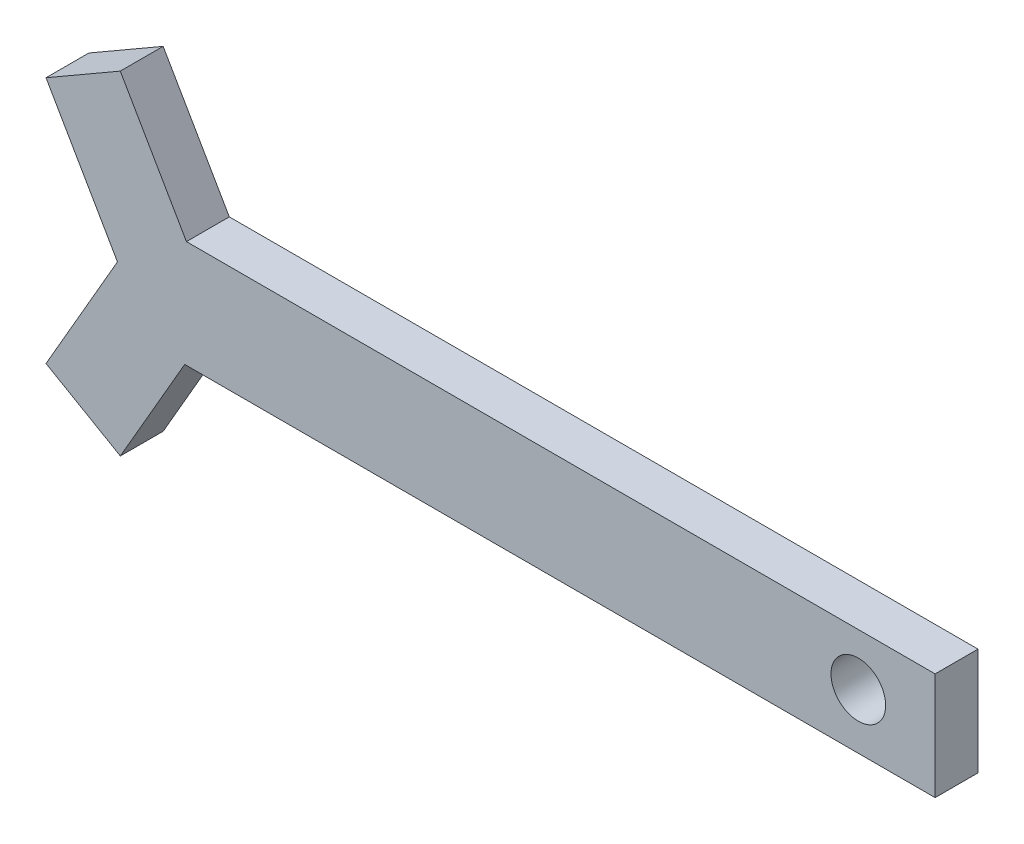
ISO-10303-21;
HEADER;
FILE_DESCRIPTION(('STEP AP214'),'2;1');
FILE_NAME('part.step','',(''),(''),'','','');
FILE_SCHEMA(('AUTOMOTIVE_DESIGN { 1 0 10303 214 1 1 1 1 }'));
ENDSEC;
DATA;
#1=APPLICATION_CONTEXT('core data for automotive mechanical design processes');
#2=APPLICATION_PROTOCOL_DEFINITION('international standard','automotive_design',2000,#1);
#3=PRODUCT_CONTEXT('',#1,'mechanical');
#4=PRODUCT('Part','Part','',(#3));
#5=PRODUCT_RELATED_PRODUCT_CATEGORY('part','',(#4));
#6=PRODUCT_DEFINITION_FORMATION('','',#4);
#7=PRODUCT_DEFINITION_CONTEXT('part definition',#1,'design');
#8=PRODUCT_DEFINITION('design','',#6,#7);
#9=PRODUCT_DEFINITION_SHAPE('','',#8);
#10=(LENGTH_UNIT() NAMED_UNIT(*) SI_UNIT(.MILLI.,.METRE.));
#11=(NAMED_UNIT(*) PLANE_ANGLE_UNIT() SI_UNIT($,.RADIAN.));
#12=(NAMED_UNIT(*) SI_UNIT($,.STERADIAN.) SOLID_ANGLE_UNIT());
#13=UNCERTAINTY_MEASURE_WITH_UNIT(LENGTH_MEASURE(1.E-05),#10,'distance_accuracy_value','');
#14=(GEOMETRIC_REPRESENTATION_CONTEXT(3) GLOBAL_UNCERTAINTY_ASSIGNED_CONTEXT((#13)) GLOBAL_UNIT_ASSIGNED_CONTEXT((#10,
#11,#12)) REPRESENTATION_CONTEXT('',''));
#15=CARTESIAN_POINT('',(0.,0.,0.));
#16=DIRECTION('',(0.,0.,1.));
#17=DIRECTION('',(1.,0.,0.));
#18=AXIS2_PLACEMENT_3D('',#15,#16,#17);
#19=CARTESIAN_POINT('',(0.,0.,4.));
#20=DIRECTION('',(0.,0.,1.));
#21=DIRECTION('',(1.,0.,0.));
#22=AXIS2_PLACEMENT_3D('',#19,#20,#21);
#23=PLANE('',#22);
#24=DIRECTION('',(0.,1.,0.));
#25=VECTOR('',#24,1.);
#26=CARTESIAN_POINT('',(52.7041909517058,-12.4004701846911,4.));
#27=LINE('',#26,#25);
#28=CARTESIAN_POINT('',(52.7041909517058,-12.4004701846911,4.));
#29=VERTEX_POINT('',#28);
#30=CARTESIAN_POINT('',(52.7041909517058,-2.40047018469109,4.));
#31=VERTEX_POINT('',#30);
#32=EDGE_CURVE('E153',#29,#31,#27,.T.);
#33=ORIENTED_EDGE('',*,*,#32,.T.);
#34=DIRECTION('',(-1.,0.,0.));
#35=VECTOR('',#34,1.);
#36=CARTESIAN_POINT('',(52.7041909517058,-2.40047018469109,4.));
#37=LINE('',#36,#35);
#38=CARTESIAN_POINT('',(-17.1361607554782,-2.40047018469109,4.));
#39=VERTEX_POINT('',#38);
#40=EDGE_CURVE('E96',#31,#39,#37,.T.);
#41=ORIENTED_EDGE('',*,*,#40,.T.);
#42=DIRECTION('',(-0.5,0.866025403784439,0.));
#43=VECTOR('',#42,1.);
#44=CARTESIAN_POINT('',(-17.1361607554782,-2.40047018469109,4.));
#45=LINE('',#44,#43);
#46=CARTESIAN_POINT('',(-23.3076426890894,8.28885008231689,4.));
#47=VERTEX_POINT('',#46);
#48=EDGE_CURVE('E171',#39,#47,#45,.T.);
#49=ORIENTED_EDGE('',*,*,#48,.T.);
#50=DIRECTION('',(-0.86602540378444,-0.499999999999997,0.));
#51=VECTOR('',#50,1.);
#52=CARTESIAN_POINT('',(-23.3076426890894,8.28885008231689,4.));
#53=LINE('',#52,#51);
#54=CARTESIAN_POINT('',(-30.2358459193649,4.28885008231693,4.));
#55=VERTEX_POINT('',#54);
#56=EDGE_CURVE('E188',#47,#55,#53,.T.);
#57=ORIENTED_EDGE('',*,*,#56,.T.);
#58=DIRECTION('',(0.5,-0.866025403784438,0.));
#59=VECTOR('',#58,1.);
#60=CARTESIAN_POINT('',(-30.2358459193649,4.28885008231693,4.));
#61=LINE('',#60,#59);
#62=CARTESIAN_POINT('',(-23.5707824099038,-7.255378551743,4.));
#63=VERTEX_POINT('',#62);
#64=EDGE_CURVE('E187',#55,#63,#61,.T.);
#65=ORIENTED_EDGE('',*,*,#64,.T.);
#66=DIRECTION('',(-0.500000000000002,-0.866025403784437,0.));
#67=VECTOR('',#66,1.);
#68=CARTESIAN_POINT('',(-23.5707824099038,-7.255378551743,4.));
#69=LINE('',#68,#67);
#70=CARTESIAN_POINT('',(-30.2358459193649,-18.7996071858029,4.));
#71=VERTEX_POINT('',#70);
#72=EDGE_CURVE('E118',#63,#71,#69,.T.);
#73=ORIENTED_EDGE('',*,*,#72,.T.);
#74=DIRECTION('',(0.866025403784438,-0.500000000000001,0.));
#75=VECTOR('',#74,1.);
#76=CARTESIAN_POINT('',(-30.2358459193649,-18.7996071858029,4.));
#77=LINE('',#76,#75);
#78=CARTESIAN_POINT('',(-23.3017258686918,-22.8030232636522,4.));
#79=VERTEX_POINT('',#78);
#80=EDGE_CURVE('E112',#71,#79,#77,.T.);
#81=ORIENTED_EDGE('',*,*,#80,.T.);
#82=DIRECTION('',(0.500000000000001,0.866025403784438,0.));
#83=VECTOR('',#82,1.);
#84=CARTESIAN_POINT('',(-23.3017258686918,-22.8030232636522,4.));
#85=LINE('',#84,#83);
#86=CARTESIAN_POINT('',(-17.2958090482942,-12.4004701846911,4.));
#87=VERTEX_POINT('',#86);
#88=EDGE_CURVE('E116',#79,#87,#85,.T.);
#89=ORIENTED_EDGE('',*,*,#88,.T.);
#90=DIRECTION('',(1.,0.,0.));
#91=VECTOR('',#90,1.);
#92=CARTESIAN_POINT('',(-17.2958090482942,-12.4004701846911,4.));
#93=LINE('',#92,#91);
#94=EDGE_CURVE('E50',#87,#29,#93,.T.);
#95=ORIENTED_EDGE('',*,*,#94,.T.);
#96=EDGE_LOOP('',(#33,#41,#49,#57,#65,#73,#81,#89,#95));
#97=FACE_BOUND('',#96,.T.);
#98=CARTESIAN_POINT('',(45.538806524661,-7.255378551743,4.));
#99=DIRECTION('',(0.,0.,1.));
#100=DIRECTION('',(1.,0.,0.));
#101=AXIS2_PLACEMENT_3D('',#98,#99,#100);
#102=CIRCLE('',#101,2.55);
#103=CARTESIAN_POINT('',(48.088806524661,-7.255378551743,4.));
#104=VERTEX_POINT('',#103);
#105=EDGE_CURVE('E140',#104,#104,#102,.T.);
#106=ORIENTED_EDGE('',*,*,#105,.F.);
#107=EDGE_LOOP('',(#106));
#108=FACE_BOUND('',#107,.T.);
#109=ADVANCED_FACE('F33',(#97,#108),#23,.T.);
#110=CARTESIAN_POINT('',(0.,0.,0.));
#111=DIRECTION('',(0.,0.,1.));
#112=DIRECTION('',(1.,0.,0.));
#113=AXIS2_PLACEMENT_3D('',#110,#111,#112);
#114=PLANE('',#113);
#115=DIRECTION('',(0.,1.,0.));
#116=VECTOR('',#115,1.);
#117=CARTESIAN_POINT('',(52.7041909517058,-12.4004701846911,0.));
#118=LINE('',#117,#116);
#119=CARTESIAN_POINT('',(52.7041909517058,-12.4004701846911,0.));
#120=VERTEX_POINT('',#119);
#121=CARTESIAN_POINT('',(52.7041909517058,-2.40047018469109,0.));
#122=VERTEX_POINT('',#121);
#123=EDGE_CURVE('E136',#120,#122,#118,.T.);
#124=ORIENTED_EDGE('',*,*,#123,.F.);
#125=DIRECTION('',(1.,0.,0.));
#126=VECTOR('',#125,1.);
#127=CARTESIAN_POINT('',(-17.2958090482942,-12.4004701846911,0.));
#128=LINE('',#127,#126);
#129=CARTESIAN_POINT('',(-17.2958090482942,-12.4004701846911,0.));
#130=VERTEX_POINT('',#129);
#131=EDGE_CURVE('E88',#130,#120,#128,.T.);
#132=ORIENTED_EDGE('',*,*,#131,.F.);
#133=DIRECTION('',(0.500000000000001,0.866025403784438,0.));
#134=VECTOR('',#133,1.);
#135=CARTESIAN_POINT('',(-23.3017258686918,-22.8030232636522,0.));
#136=LINE('',#135,#134);
#137=CARTESIAN_POINT('',(-23.3017258686918,-22.8030232636522,0.));
#138=VERTEX_POINT('',#137);
#139=EDGE_CURVE('E82',#138,#130,#136,.T.);
#140=ORIENTED_EDGE('',*,*,#139,.F.);
#141=DIRECTION('',(0.866025403784438,-0.500000000000001,0.));
#142=VECTOR('',#141,1.);
#143=CARTESIAN_POINT('',(-30.2358459193649,-18.7996071858029,0.));
#144=LINE('',#143,#142);
#145=CARTESIAN_POINT('',(-30.2358459193649,-18.7996071858029,0.));
#146=VERTEX_POINT('',#145);
#147=EDGE_CURVE('E126',#146,#138,#144,.T.);
#148=ORIENTED_EDGE('',*,*,#147,.F.);
#149=DIRECTION('',(-0.500000000000002,-0.866025403784437,0.));
#150=VECTOR('',#149,1.);
#151=CARTESIAN_POINT('',(-23.5707824099038,-7.255378551743,0.));
#152=LINE('',#151,#150);
#153=CARTESIAN_POINT('',(-23.5707824099038,-7.255378551743,0.));
#154=VERTEX_POINT('',#153);
#155=EDGE_CURVE('E148',#154,#146,#152,.T.);
#156=ORIENTED_EDGE('',*,*,#155,.F.);
#157=DIRECTION('',(0.5,-0.866025403784438,0.));
#158=VECTOR('',#157,1.);
#159=CARTESIAN_POINT('',(-30.2358459193649,4.28885008231693,0.));
#160=LINE('',#159,#158);
#161=CARTESIAN_POINT('',(-30.2358459193649,4.28885008231693,0.));
#162=VERTEX_POINT('',#161);
#163=EDGE_CURVE('E146',#162,#154,#160,.T.);
#164=ORIENTED_EDGE('',*,*,#163,.F.);
#165=DIRECTION('',(-0.86602540378444,-0.499999999999997,0.));
#166=VECTOR('',#165,1.);
#167=CARTESIAN_POINT('',(-23.3076426890894,8.28885008231689,0.));
#168=LINE('',#167,#166);
#169=CARTESIAN_POINT('',(-23.3076426890894,8.28885008231689,0.));
#170=VERTEX_POINT('',#169);
#171=EDGE_CURVE('E144',#170,#162,#168,.T.);
#172=ORIENTED_EDGE('',*,*,#171,.F.);
#173=DIRECTION('',(-0.5,0.866025403784439,0.));
#174=VECTOR('',#173,1.);
#175=CARTESIAN_POINT('',(-17.1361607554782,-2.40047018469109,0.));
#176=LINE('',#175,#174);
#177=CARTESIAN_POINT('',(-17.1361607554782,-2.40047018469109,0.));
#178=VERTEX_POINT('',#177);
#179=EDGE_CURVE('E142',#178,#170,#176,.T.);
#180=ORIENTED_EDGE('',*,*,#179,.F.);
#181=DIRECTION('',(-1.,0.,0.));
#182=VECTOR('',#181,1.);
#183=CARTESIAN_POINT('',(52.7041909517058,-2.40047018469109,0.));
#184=LINE('',#183,#182);
#185=EDGE_CURVE('E139',#122,#178,#184,.T.);
#186=ORIENTED_EDGE('',*,*,#185,.F.);
#187=EDGE_LOOP('',(#124,#132,#140,#148,#156,#164,#172,#180,#186));
#188=FACE_BOUND('',#187,.T.);
#189=CARTESIAN_POINT('',(45.538806524661,-7.255378551743,0.));
#190=DIRECTION('',(0.,0.,1.));
#191=DIRECTION('',(1.,0.,0.));
#192=AXIS2_PLACEMENT_3D('',#189,#190,#191);
#193=CIRCLE('',#192,2.55);
#194=CARTESIAN_POINT('',(48.088806524661,-7.255378551743,0.));
#195=VERTEX_POINT('',#194);
#196=EDGE_CURVE('E195',#195,#195,#193,.T.);
#197=ORIENTED_EDGE('',*,*,#196,.T.);
#198=EDGE_LOOP('',(#197));
#199=FACE_BOUND('',#198,.T.);
#200=ADVANCED_FACE('F175',(#188,#199),#114,.F.);
#201=CARTESIAN_POINT('',(52.7041909517058,-12.4004701846911,4.));
#202=DIRECTION('',(-1.,0.,0.));
#203=DIRECTION('',(0.,0.,1.));
#204=AXIS2_PLACEMENT_3D('',#201,#202,#203);
#205=PLANE('',#204);
#206=ORIENTED_EDGE('',*,*,#123,.T.);
#207=DIRECTION('',(0.,0.,-1.));
#208=VECTOR('',#207,1.);
#209=CARTESIAN_POINT('',(52.7041909517058,-2.40047018469109,4.));
#210=LINE('',#209,#208);
#211=EDGE_CURVE('E11',#31,#122,#210,.T.);
#212=ORIENTED_EDGE('',*,*,#211,.F.);
#213=ORIENTED_EDGE('',*,*,#32,.F.);
#214=DIRECTION('',(0.,0.,-1.));
#215=VECTOR('',#214,1.);
#216=CARTESIAN_POINT('',(52.7041909517058,-12.4004701846911,4.));
#217=LINE('',#216,#215);
#218=EDGE_CURVE('E132',#29,#120,#217,.T.);
#219=ORIENTED_EDGE('',*,*,#218,.T.);
#220=EDGE_LOOP('',(#206,#212,#213,#219));
#221=FACE_BOUND('',#220,.T.);
#222=ADVANCED_FACE('F35',(#221),#205,.F.);
#223=CARTESIAN_POINT('',(52.7041909517058,-2.40047018469109,4.));
#224=DIRECTION('',(0.,-1.,0.));
#225=DIRECTION('',(1.,0.,0.));
#226=AXIS2_PLACEMENT_3D('',#223,#224,#225);
#227=PLANE('',#226);
#228=ORIENTED_EDGE('',*,*,#185,.T.);
#229=DIRECTION('',(0.,0.,-1.));
#230=VECTOR('',#229,1.);
#231=CARTESIAN_POINT('',(-17.1361607554782,-2.40047018469109,4.));
#232=LINE('',#231,#230);
#233=EDGE_CURVE('E42',#39,#178,#232,.T.);
#234=ORIENTED_EDGE('',*,*,#233,.F.);
#235=ORIENTED_EDGE('',*,*,#40,.F.);
#236=ORIENTED_EDGE('',*,*,#211,.T.);
#237=EDGE_LOOP('',(#228,#234,#235,#236));
#238=FACE_BOUND('',#237,.T.);
#239=ADVANCED_FACE('F227',(#238),#227,.F.);
#240=CARTESIAN_POINT('',(-17.1361607554782,-2.40047018469109,4.));
#241=DIRECTION('',(-0.866025403784439,-0.5,0.));
#242=DIRECTION('',(0.5,-0.866025403784439,0.));
#243=AXIS2_PLACEMENT_3D('',#240,#241,#242);
#244=PLANE('',#243);
#245=ORIENTED_EDGE('',*,*,#179,.T.);
#246=DIRECTION('',(0.,0.,-1.));
#247=VECTOR('',#246,1.);
#248=CARTESIAN_POINT('',(-23.3076426890894,8.28885008231689,4.));
#249=LINE('',#248,#247);
#250=EDGE_CURVE('E163',#47,#170,#249,.T.);
#251=ORIENTED_EDGE('',*,*,#250,.F.);
#252=ORIENTED_EDGE('',*,*,#48,.F.);
#253=ORIENTED_EDGE('',*,*,#233,.T.);
#254=EDGE_LOOP('',(#245,#251,#252,#253));
#255=FACE_BOUND('',#254,.T.);
#256=ADVANCED_FACE('F169',(#255),#244,.F.);
#257=CARTESIAN_POINT('',(-23.3076426890894,8.28885008231689,4.));
#258=DIRECTION('',(0.499999999999997,-0.86602540378444,0.));
#259=DIRECTION('',(0.86602540378444,0.499999999999997,0.));
#260=AXIS2_PLACEMENT_3D('',#257,#258,#259);
#261=PLANE('',#260);
#262=ORIENTED_EDGE('',*,*,#171,.T.);
#263=DIRECTION('',(0.,0.,-1.));
#264=VECTOR('',#263,1.);
#265=CARTESIAN_POINT('',(-30.2358459193649,4.28885008231693,4.));
#266=LINE('',#265,#264);
#267=EDGE_CURVE('E160',#55,#162,#266,.T.);
#268=ORIENTED_EDGE('',*,*,#267,.F.);
#269=ORIENTED_EDGE('',*,*,#56,.F.);
#270=ORIENTED_EDGE('',*,*,#250,.T.);
#271=EDGE_LOOP('',(#262,#268,#269,#270));
#272=FACE_BOUND('',#271,.T.);
#273=ADVANCED_FACE('F181',(#272),#261,.F.);
#274=CARTESIAN_POINT('',(-30.2358459193649,4.28885008231693,4.));
#275=DIRECTION('',(0.866025403784438,0.5,0.));
#276=DIRECTION('',(-0.5,0.866025403784438,0.));
#277=AXIS2_PLACEMENT_3D('',#274,#275,#276);
#278=PLANE('',#277);
#279=ORIENTED_EDGE('',*,*,#163,.T.);
#280=DIRECTION('',(0.,0.,-1.));
#281=VECTOR('',#280,1.);
#282=CARTESIAN_POINT('',(-23.5707824099038,-7.255378551743,4.));
#283=LINE('',#282,#281);
#284=EDGE_CURVE('E157',#63,#154,#283,.T.);
#285=ORIENTED_EDGE('',*,*,#284,.F.);
#286=ORIENTED_EDGE('',*,*,#64,.F.);
#287=ORIENTED_EDGE('',*,*,#267,.T.);
#288=EDGE_LOOP('',(#279,#285,#286,#287));
#289=FACE_BOUND('',#288,.T.);
#290=ADVANCED_FACE('F185',(#289),#278,.F.);
#291=CARTESIAN_POINT('',(-23.5707824099038,-7.255378551743,4.));
#292=DIRECTION('',(0.866025403784437,-0.500000000000002,0.));
#293=DIRECTION('',(0.500000000000002,0.866025403784437,0.));
#294=AXIS2_PLACEMENT_3D('',#291,#292,#293);
#295=PLANE('',#294);
#296=ORIENTED_EDGE('',*,*,#155,.T.);
#297=DIRECTION('',(0.,0.,-1.));
#298=VECTOR('',#297,1.);
#299=CARTESIAN_POINT('',(-30.2358459193649,-18.7996071858029,4.));
#300=LINE('',#299,#298);
#301=EDGE_CURVE('E127',#71,#146,#300,.T.);
#302=ORIENTED_EDGE('',*,*,#301,.F.);
#303=ORIENTED_EDGE('',*,*,#72,.F.);
#304=ORIENTED_EDGE('',*,*,#284,.T.);
#305=EDGE_LOOP('',(#296,#302,#303,#304));
#306=FACE_BOUND('',#305,.T.);
#307=ADVANCED_FACE('F218',(#306),#295,.F.);
#308=CARTESIAN_POINT('',(-30.2358459193649,-18.7996071858029,4.));
#309=DIRECTION('',(0.500000000000001,0.866025403784438,0.));
#310=DIRECTION('',(-0.866025403784438,0.500000000000001,0.));
#311=AXIS2_PLACEMENT_3D('',#308,#309,#310);
#312=PLANE('',#311);
#313=ORIENTED_EDGE('',*,*,#147,.T.);
#314=DIRECTION('',(0.,0.,-1.));
#315=VECTOR('',#314,1.);
#316=CARTESIAN_POINT('',(-23.3017258686918,-22.8030232636522,4.));
#317=LINE('',#316,#315);
#318=EDGE_CURVE('E123',#79,#138,#317,.T.);
#319=ORIENTED_EDGE('',*,*,#318,.F.);
#320=ORIENTED_EDGE('',*,*,#80,.F.);
#321=ORIENTED_EDGE('',*,*,#301,.T.);
#322=EDGE_LOOP('',(#313,#319,#320,#321));
#323=FACE_BOUND('',#322,.T.);
#324=ADVANCED_FACE('F124',(#323),#312,.F.);
#325=CARTESIAN_POINT('',(-23.3017258686918,-22.8030232636522,4.));
#326=DIRECTION('',(-0.866025403784438,0.500000000000001,0.));
#327=DIRECTION('',(-0.500000000000001,-0.866025403784438,0.));
#328=AXIS2_PLACEMENT_3D('',#325,#326,#327);
#329=PLANE('',#328);
#330=ORIENTED_EDGE('',*,*,#139,.T.);
#331=DIRECTION('',(0.,0.,-1.));
#332=VECTOR('',#331,1.);
#333=CARTESIAN_POINT('',(-17.2958090482942,-12.4004701846911,4.));
#334=LINE('',#333,#332);
#335=EDGE_CURVE('E128',#87,#130,#334,.T.);
#336=ORIENTED_EDGE('',*,*,#335,.F.);
#337=ORIENTED_EDGE('',*,*,#88,.F.);
#338=ORIENTED_EDGE('',*,*,#318,.T.);
#339=EDGE_LOOP('',(#330,#336,#337,#338));
#340=FACE_BOUND('',#339,.T.);
#341=ADVANCED_FACE('F130',(#340),#329,.F.);
#342=CARTESIAN_POINT('',(-17.2958090482942,-12.4004701846911,4.));
#343=DIRECTION('',(0.,1.,0.));
#344=DIRECTION('',(0.,0.,1.));
#345=AXIS2_PLACEMENT_3D('',#342,#343,#344);
#346=PLANE('',#345);
#347=ORIENTED_EDGE('',*,*,#131,.T.);
#348=ORIENTED_EDGE('',*,*,#218,.F.);
#349=ORIENTED_EDGE('',*,*,#94,.F.);
#350=ORIENTED_EDGE('',*,*,#335,.T.);
#351=EDGE_LOOP('',(#347,#348,#349,#350));
#352=FACE_BOUND('',#351,.T.);
#353=ADVANCED_FACE('F211',(#352),#346,.F.);
#354=CARTESIAN_POINT('',(45.538806524661,-7.255378551743,4.));
#355=DIRECTION('',(0.,0.,-1.));
#356=DIRECTION('',(-1.,0.,0.));
#357=AXIS2_PLACEMENT_3D('',#354,#355,#356);
#358=CYLINDRICAL_SURFACE('',#357,2.55);
#359=ORIENTED_EDGE('',*,*,#105,.T.);
#360=EDGE_LOOP('',(#359));
#361=FACE_BOUND('',#360,.T.);
#362=ORIENTED_EDGE('',*,*,#196,.F.);
#363=EDGE_LOOP('',(#362));
#364=FACE_BOUND('',#363,.T.);
#365=ADVANCED_FACE('F201',(#361,#364),#358,.F.);
#366=CLOSED_SHELL('',(#109,#200,#222,#239,#256,#273,#290,#307,#324,#341,#353,#365));
#367=MANIFOLD_SOLID_BREP('B2',#366);
#368=ADVANCED_BREP_SHAPE_REPRESENTATION('',(#18,#367),#14);
#369=SHAPE_DEFINITION_REPRESENTATION(#9,#368);
ENDSEC;
END-ISO-10303-21;
